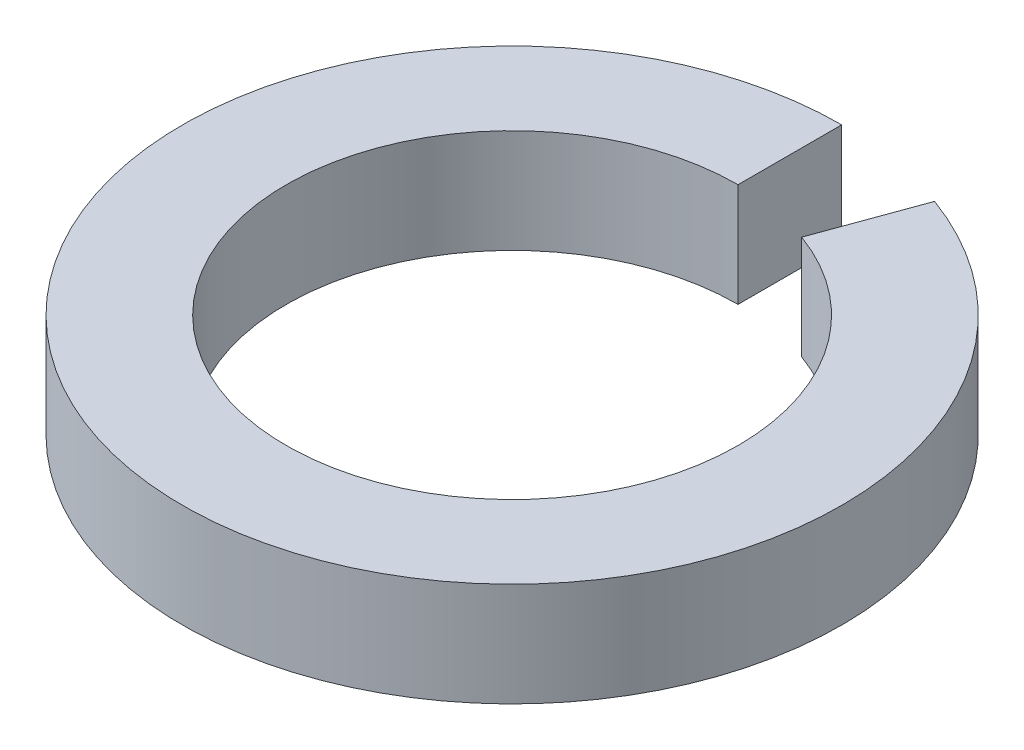
ISO-10303-21;
HEADER;
FILE_DESCRIPTION(('STEP AP214'),'2;1');
FILE_NAME('part.step','',(''),(''),'','','');
FILE_SCHEMA(('AUTOMOTIVE_DESIGN { 1 0 10303 214 1 1 1 1 }'));
ENDSEC;
DATA;
#1=APPLICATION_CONTEXT('core data for automotive mechanical design processes');
#2=APPLICATION_PROTOCOL_DEFINITION('international standard','automotive_design',2000,#1);
#3=PRODUCT_CONTEXT('',#1,'mechanical');
#4=PRODUCT('Part','Part','',(#3));
#5=PRODUCT_RELATED_PRODUCT_CATEGORY('part','',(#4));
#6=PRODUCT_DEFINITION_FORMATION('','',#4);
#7=PRODUCT_DEFINITION_CONTEXT('part definition',#1,'design');
#8=PRODUCT_DEFINITION('design','',#6,#7);
#9=PRODUCT_DEFINITION_SHAPE('','',#8);
#10=(LENGTH_UNIT() NAMED_UNIT(*) SI_UNIT(.MILLI.,.METRE.));
#11=(NAMED_UNIT(*) PLANE_ANGLE_UNIT() SI_UNIT($,.RADIAN.));
#12=(NAMED_UNIT(*) SI_UNIT($,.STERADIAN.) SOLID_ANGLE_UNIT());
#13=UNCERTAINTY_MEASURE_WITH_UNIT(LENGTH_MEASURE(1.E-05),#10,'distance_accuracy_value','');
#14=(GEOMETRIC_REPRESENTATION_CONTEXT(3) GLOBAL_UNCERTAINTY_ASSIGNED_CONTEXT((#13)) GLOBAL_UNIT_ASSIGNED_CONTEXT((#10,
#11,#12)) REPRESENTATION_CONTEXT('',''));
#15=CARTESIAN_POINT('',(0.,0.,0.));
#16=DIRECTION('',(0.,0.,1.));
#17=DIRECTION('',(1.,0.,0.));
#18=AXIS2_PLACEMENT_3D('',#15,#16,#17);
#19=CARTESIAN_POINT('',(0.,1.4,0.));
#20=DIRECTION('',(0.,-1.,0.));
#21=DIRECTION('',(0.,0.,-1.));
#22=AXIS2_PLACEMENT_3D('',#19,#20,#21);
#23=CYLINDRICAL_SURFACE('',#22,3.05);
#24=CARTESIAN_POINT('',(0.,0.,0.));
#25=DIRECTION('',(0.,-1.,0.));
#26=DIRECTION('',(0.,0.,1.));
#27=AXIS2_PLACEMENT_3D('',#24,#25,#26);
#28=CIRCLE('',#27,3.05);
#29=CARTESIAN_POINT('',(1.04316143714329,0.,-2.86606249339702));
#30=VERTEX_POINT('',#29);
#31=CARTESIAN_POINT('',(0.,0.,-3.05));
#32=VERTEX_POINT('',#31);
#33=EDGE_CURVE('E94',#30,#32,#28,.T.);
#34=ORIENTED_EDGE('',*,*,#33,.T.);
#35=DIRECTION('',(0.,-1.,0.));
#36=VECTOR('',#35,1.);
#37=CARTESIAN_POINT('',(0.,1.4,-3.05));
#38=LINE('',#37,#36);
#39=CARTESIAN_POINT('',(0.,1.4,-3.05));
#40=VERTEX_POINT('',#39);
#41=EDGE_CURVE('E11',#40,#32,#38,.T.);
#42=ORIENTED_EDGE('',*,*,#41,.F.);
#43=CARTESIAN_POINT('',(0.,1.4,0.));
#44=DIRECTION('',(0.,-1.,0.));
#45=DIRECTION('',(0.,0.,1.));
#46=AXIS2_PLACEMENT_3D('',#43,#44,#45);
#47=CIRCLE('',#46,3.05);
#48=CARTESIAN_POINT('',(1.04316143714329,1.4,-2.86606249339702));
#49=VERTEX_POINT('',#48);
#50=EDGE_CURVE('E82',#49,#40,#47,.T.);
#51=ORIENTED_EDGE('',*,*,#50,.F.);
#52=DIRECTION('',(0.,-1.,0.));
#53=VECTOR('',#52,1.);
#54=CARTESIAN_POINT('',(1.04316143714329,1.4,-2.86606249339702));
#55=LINE('',#54,#53);
#56=EDGE_CURVE('E90',#49,#30,#55,.T.);
#57=ORIENTED_EDGE('',*,*,#56,.T.);
#58=EDGE_LOOP('',(#34,#42,#51,#57));
#59=FACE_BOUND('',#58,.T.);
#60=ADVANCED_FACE('F31',(#59),#23,.F.);
#61=CARTESIAN_POINT('',(0.,1.4,-3.05));
#62=DIRECTION('',(-1.,0.,0.));
#63=DIRECTION('',(0.,0.,1.));
#64=AXIS2_PLACEMENT_3D('',#61,#62,#63);
#65=PLANE('',#64);
#66=DIRECTION('',(0.,0.,-1.));
#67=VECTOR('',#66,1.);
#68=CARTESIAN_POINT('',(0.,0.,-3.05));
#69=LINE('',#68,#67);
#70=CARTESIAN_POINT('',(0.,0.,-4.45));
#71=VERTEX_POINT('',#70);
#72=EDGE_CURVE('E86',#32,#71,#69,.T.);
#73=ORIENTED_EDGE('',*,*,#72,.T.);
#74=DIRECTION('',(0.,-1.,0.));
#75=VECTOR('',#74,1.);
#76=CARTESIAN_POINT('',(0.,1.4,-4.45));
#77=LINE('',#76,#75);
#78=CARTESIAN_POINT('',(0.,1.4,-4.45));
#79=VERTEX_POINT('',#78);
#80=EDGE_CURVE('E39',#79,#71,#77,.T.);
#81=ORIENTED_EDGE('',*,*,#80,.F.);
#82=DIRECTION('',(0.,0.,-1.));
#83=VECTOR('',#82,1.);
#84=CARTESIAN_POINT('',(0.,1.4,-3.05));
#85=LINE('',#84,#83);
#86=EDGE_CURVE('E77',#40,#79,#85,.T.);
#87=ORIENTED_EDGE('',*,*,#86,.F.);
#88=ORIENTED_EDGE('',*,*,#41,.T.);
#89=EDGE_LOOP('',(#73,#81,#87,#88));
#90=FACE_BOUND('',#89,.T.);
#91=ADVANCED_FACE('F85',(#90),#65,.F.);
#92=CARTESIAN_POINT('',(0.,1.4,0.));
#93=DIRECTION('',(0.,-1.,0.));
#94=DIRECTION('',(0.,0.,-1.));
#95=AXIS2_PLACEMENT_3D('',#92,#93,#94);
#96=CYLINDRICAL_SURFACE('',#95,4.45);
#97=CARTESIAN_POINT('',(0.,0.,0.));
#98=DIRECTION('',(0.,1.,0.));
#99=DIRECTION('',(0.,0.,1.));
#100=AXIS2_PLACEMENT_3D('',#97,#98,#99);
#101=CIRCLE('',#100,4.45);
#102=CARTESIAN_POINT('',(1.52198963779922,0.,-4.18163216249729));
#103=VERTEX_POINT('',#102);
#104=EDGE_CURVE('E64',#71,#103,#101,.T.);
#105=ORIENTED_EDGE('',*,*,#104,.T.);
#106=DIRECTION('',(0.,-1.,0.));
#107=VECTOR('',#106,1.);
#108=CARTESIAN_POINT('',(1.52198963779922,1.4,-4.18163216249729));
#109=LINE('',#108,#107);
#110=CARTESIAN_POINT('',(1.52198963779922,1.4,-4.18163216249729));
#111=VERTEX_POINT('',#110);
#112=EDGE_CURVE('E87',#111,#103,#109,.T.);
#113=ORIENTED_EDGE('',*,*,#112,.F.);
#114=CARTESIAN_POINT('',(0.,1.4,0.));
#115=DIRECTION('',(0.,1.,0.));
#116=DIRECTION('',(0.,0.,1.));
#117=AXIS2_PLACEMENT_3D('',#114,#115,#116);
#118=CIRCLE('',#117,4.45);
#119=EDGE_CURVE('E80',#79,#111,#118,.T.);
#120=ORIENTED_EDGE('',*,*,#119,.F.);
#121=ORIENTED_EDGE('',*,*,#80,.T.);
#122=EDGE_LOOP('',(#105,#113,#120,#121));
#123=FACE_BOUND('',#122,.T.);
#124=ADVANCED_FACE('F88',(#123),#96,.T.);
#125=CARTESIAN_POINT('',(1.04316143714329,1.4,-2.86606249339702));
#126=DIRECTION('',(0.939692620785908,0.,0.342020143325669));
#127=DIRECTION('',(0.342020143325669,0.,-0.939692620785908));
#128=AXIS2_PLACEMENT_3D('',#125,#126,#127);
#129=PLANE('',#128);
#130=DIRECTION('',(-0.342020143325669,0.,0.939692620785908));
#131=VECTOR('',#130,1.);
#132=CARTESIAN_POINT('',(1.04316143714329,0.,-2.86606249339702));
#133=LINE('',#132,#131);
#134=EDGE_CURVE('E70',#103,#30,#133,.T.);
#135=ORIENTED_EDGE('',*,*,#134,.T.);
#136=ORIENTED_EDGE('',*,*,#56,.F.);
#137=DIRECTION('',(-0.342020143325669,0.,0.939692620785908));
#138=VECTOR('',#137,1.);
#139=CARTESIAN_POINT('',(1.04316143714329,1.4,-2.86606249339702));
#140=LINE('',#139,#138);
#141=EDGE_CURVE('E47',#111,#49,#140,.T.);
#142=ORIENTED_EDGE('',*,*,#141,.F.);
#143=ORIENTED_EDGE('',*,*,#112,.T.);
#144=EDGE_LOOP('',(#135,#136,#142,#143));
#145=FACE_BOUND('',#144,.T.);
#146=ADVANCED_FACE('F101',(#145),#129,.F.);
#147=CARTESIAN_POINT('',(0.,1.4,0.));
#148=DIRECTION('',(0.,1.,0.));
#149=DIRECTION('',(0.,0.,1.));
#150=AXIS2_PLACEMENT_3D('',#147,#148,#149);
#151=PLANE('',#150);
#152=ORIENTED_EDGE('',*,*,#50,.T.);
#153=ORIENTED_EDGE('',*,*,#86,.T.);
#154=ORIENTED_EDGE('',*,*,#119,.T.);
#155=ORIENTED_EDGE('',*,*,#141,.T.);
#156=EDGE_LOOP('',(#152,#153,#154,#155));
#157=FACE_BOUND('',#156,.T.);
#158=ADVANCED_FACE('F78',(#157),#151,.T.);
#159=CARTESIAN_POINT('',(0.,0.,0.));
#160=DIRECTION('',(0.,1.,0.));
#161=DIRECTION('',(0.,0.,1.));
#162=AXIS2_PLACEMENT_3D('',#159,#160,#161);
#163=PLANE('',#162);
#164=ORIENTED_EDGE('',*,*,#33,.F.);
#165=ORIENTED_EDGE('',*,*,#134,.F.);
#166=ORIENTED_EDGE('',*,*,#104,.F.);
#167=ORIENTED_EDGE('',*,*,#72,.F.);
#168=EDGE_LOOP('',(#164,#165,#166,#167));
#169=FACE_BOUND('',#168,.T.);
#170=ADVANCED_FACE('F104',(#169),#163,.F.);
#171=CLOSED_SHELL('',(#60,#91,#124,#146,#158,#170));
#172=MANIFOLD_SOLID_BREP('B2',#171);
#173=ADVANCED_BREP_SHAPE_REPRESENTATION('',(#18,#172),#14);
#174=SHAPE_DEFINITION_REPRESENTATION(#9,#173);
ENDSEC;
END-ISO-10303-21;
